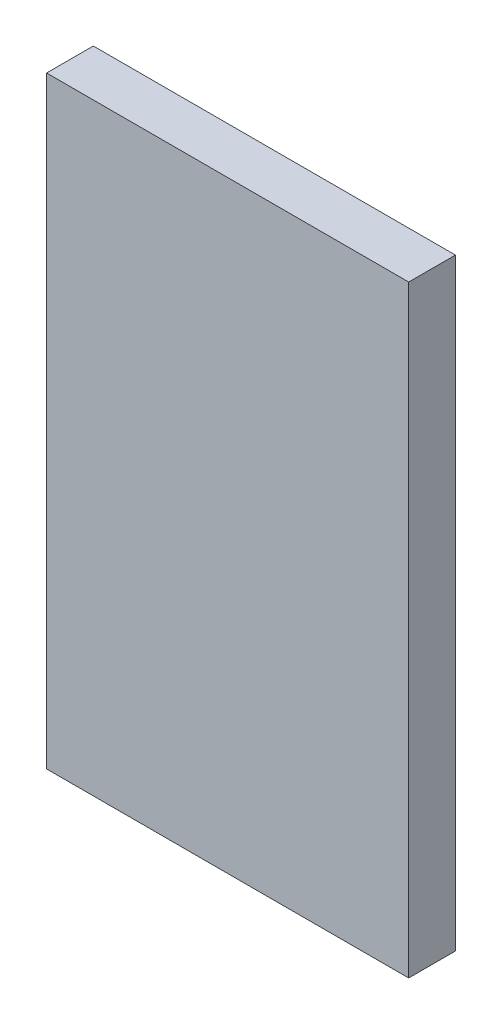
ISO-10303-21;
HEADER;
FILE_DESCRIPTION(('STEP AP214'),'2;1');
FILE_NAME('part.step','',(''),(''),'','','');
FILE_SCHEMA(('AUTOMOTIVE_DESIGN { 1 0 10303 214 1 1 1 1 }'));
ENDSEC;
DATA;
#1=APPLICATION_CONTEXT('core data for automotive mechanical design processes');
#2=APPLICATION_PROTOCOL_DEFINITION('international standard','automotive_design',2000,#1);
#3=PRODUCT_CONTEXT('',#1,'mechanical');
#4=PRODUCT('Part','Part','',(#3));
#5=PRODUCT_RELATED_PRODUCT_CATEGORY('part','',(#4));
#6=PRODUCT_DEFINITION_FORMATION('','',#4);
#7=PRODUCT_DEFINITION_CONTEXT('part definition',#1,'design');
#8=PRODUCT_DEFINITION('design','',#6,#7);
#9=PRODUCT_DEFINITION_SHAPE('','',#8);
#10=(LENGTH_UNIT() NAMED_UNIT(*) SI_UNIT(.MILLI.,.METRE.));
#11=(NAMED_UNIT(*) PLANE_ANGLE_UNIT() SI_UNIT($,.RADIAN.));
#12=(NAMED_UNIT(*) SI_UNIT($,.STERADIAN.) SOLID_ANGLE_UNIT());
#13=UNCERTAINTY_MEASURE_WITH_UNIT(LENGTH_MEASURE(1.E-05),#10,'distance_accuracy_value','');
#14=(GEOMETRIC_REPRESENTATION_CONTEXT(3) GLOBAL_UNCERTAINTY_ASSIGNED_CONTEXT((#13)) GLOBAL_UNIT_ASSIGNED_CONTEXT((#10,
#11,#12)) REPRESENTATION_CONTEXT('',''));
#15=CARTESIAN_POINT('',(0.,0.,0.));
#16=DIRECTION('',(0.,0.,1.));
#17=DIRECTION('',(1.,0.,0.));
#18=AXIS2_PLACEMENT_3D('',#15,#16,#17);
#19=CARTESIAN_POINT('',(-7.75,-12.9,2.));
#20=DIRECTION('',(1.,0.,0.));
#21=DIRECTION('',(0.,0.,-1.));
#22=AXIS2_PLACEMENT_3D('',#19,#20,#21);
#23=PLANE('',#22);
#24=DIRECTION('',(0.,-1.,0.));
#25=VECTOR('',#24,1.);
#26=CARTESIAN_POINT('',(-7.75,-12.9,0.));
#27=LINE('',#26,#25);
#28=CARTESIAN_POINT('',(-7.75,12.9,0.));
#29=VERTEX_POINT('',#28);
#30=CARTESIAN_POINT('',(-7.75,-12.9,0.));
#31=VERTEX_POINT('',#30);
#32=EDGE_CURVE('E100',#29,#31,#27,.T.);
#33=ORIENTED_EDGE('',*,*,#32,.T.);
#34=DIRECTION('',(0.,0.,-1.));
#35=VECTOR('',#34,1.);
#36=CARTESIAN_POINT('',(-7.75,-12.9,2.));
#37=LINE('',#36,#35);
#38=CARTESIAN_POINT('',(-7.75,-12.9,2.));
#39=VERTEX_POINT('',#38);
#40=EDGE_CURVE('E11',#39,#31,#37,.T.);
#41=ORIENTED_EDGE('',*,*,#40,.F.);
#42=DIRECTION('',(0.,-1.,0.));
#43=VECTOR('',#42,1.);
#44=CARTESIAN_POINT('',(-7.75,-12.9,2.));
#45=LINE('',#44,#43);
#46=CARTESIAN_POINT('',(-7.75,12.9,2.));
#47=VERTEX_POINT('',#46);
#48=EDGE_CURVE('E88',#47,#39,#45,.T.);
#49=ORIENTED_EDGE('',*,*,#48,.F.);
#50=DIRECTION('',(0.,0.,-1.));
#51=VECTOR('',#50,1.);
#52=CARTESIAN_POINT('',(-7.75,12.9,2.));
#53=LINE('',#52,#51);
#54=EDGE_CURVE('E96',#47,#29,#53,.T.);
#55=ORIENTED_EDGE('',*,*,#54,.T.);
#56=EDGE_LOOP('',(#33,#41,#49,#55));
#57=FACE_BOUND('',#56,.T.);
#58=ADVANCED_FACE('F37',(#57),#23,.F.);
#59=CARTESIAN_POINT('',(7.75,-12.9,2.));
#60=DIRECTION('',(0.,1.,0.));
#61=DIRECTION('',(-1.,0.,0.));
#62=AXIS2_PLACEMENT_3D('',#59,#60,#61);
#63=PLANE('',#62);
#64=DIRECTION('',(1.,0.,0.));
#65=VECTOR('',#64,1.);
#66=CARTESIAN_POINT('',(7.75,-12.9,0.));
#67=LINE('',#66,#65);
#68=CARTESIAN_POINT('',(7.75,-12.9,0.));
#69=VERTEX_POINT('',#68);
#70=EDGE_CURVE('E92',#31,#69,#67,.T.);
#71=ORIENTED_EDGE('',*,*,#70,.T.);
#72=DIRECTION('',(0.,0.,-1.));
#73=VECTOR('',#72,1.);
#74=CARTESIAN_POINT('',(7.75,-12.9,2.));
#75=LINE('',#74,#73);
#76=CARTESIAN_POINT('',(7.75,-12.9,2.));
#77=VERTEX_POINT('',#76);
#78=EDGE_CURVE('E45',#77,#69,#75,.T.);
#79=ORIENTED_EDGE('',*,*,#78,.F.);
#80=DIRECTION('',(1.,0.,0.));
#81=VECTOR('',#80,1.);
#82=CARTESIAN_POINT('',(7.75,-12.9,2.));
#83=LINE('',#82,#81);
#84=EDGE_CURVE('E83',#39,#77,#83,.T.);
#85=ORIENTED_EDGE('',*,*,#84,.F.);
#86=ORIENTED_EDGE('',*,*,#40,.T.);
#87=EDGE_LOOP('',(#71,#79,#85,#86));
#88=FACE_BOUND('',#87,.T.);
#89=ADVANCED_FACE('F91',(#88),#63,.F.);
#90=CARTESIAN_POINT('',(7.75,-12.9,2.));
#91=DIRECTION('',(-1.,0.,0.));
#92=DIRECTION('',(0.,0.,1.));
#93=AXIS2_PLACEMENT_3D('',#90,#91,#92);
#94=PLANE('',#93);
#95=DIRECTION('',(0.,1.,0.));
#96=VECTOR('',#95,1.);
#97=CARTESIAN_POINT('',(7.75,-12.9,0.));
#98=LINE('',#97,#96);
#99=CARTESIAN_POINT('',(7.75,12.9,0.));
#100=VERTEX_POINT('',#99);
#101=EDGE_CURVE('E70',#69,#100,#98,.T.);
#102=ORIENTED_EDGE('',*,*,#101,.T.);
#103=DIRECTION('',(0.,0.,-1.));
#104=VECTOR('',#103,1.);
#105=CARTESIAN_POINT('',(7.75,12.9,2.));
#106=LINE('',#105,#104);
#107=CARTESIAN_POINT('',(7.75,12.9,2.));
#108=VERTEX_POINT('',#107);
#109=EDGE_CURVE('E93',#108,#100,#106,.T.);
#110=ORIENTED_EDGE('',*,*,#109,.F.);
#111=DIRECTION('',(0.,1.,0.));
#112=VECTOR('',#111,1.);
#113=CARTESIAN_POINT('',(7.75,-12.9,2.));
#114=LINE('',#113,#112);
#115=EDGE_CURVE('E86',#77,#108,#114,.T.);
#116=ORIENTED_EDGE('',*,*,#115,.F.);
#117=ORIENTED_EDGE('',*,*,#78,.T.);
#118=EDGE_LOOP('',(#102,#110,#116,#117));
#119=FACE_BOUND('',#118,.T.);
#120=ADVANCED_FACE('F94',(#119),#94,.F.);
#121=CARTESIAN_POINT('',(7.75,12.9,2.));
#122=DIRECTION('',(0.,-1.,0.));
#123=DIRECTION('',(1.,0.,0.));
#124=AXIS2_PLACEMENT_3D('',#121,#122,#123);
#125=PLANE('',#124);
#126=DIRECTION('',(-1.,0.,0.));
#127=VECTOR('',#126,1.);
#128=CARTESIAN_POINT('',(7.75,12.9,0.));
#129=LINE('',#128,#127);
#130=EDGE_CURVE('E76',#100,#29,#129,.T.);
#131=ORIENTED_EDGE('',*,*,#130,.T.);
#132=ORIENTED_EDGE('',*,*,#54,.F.);
#133=DIRECTION('',(-1.,0.,0.));
#134=VECTOR('',#133,1.);
#135=CARTESIAN_POINT('',(7.75,12.9,2.));
#136=LINE('',#135,#134);
#137=EDGE_CURVE('E53',#108,#47,#136,.T.);
#138=ORIENTED_EDGE('',*,*,#137,.F.);
#139=ORIENTED_EDGE('',*,*,#109,.T.);
#140=EDGE_LOOP('',(#131,#132,#138,#139));
#141=FACE_BOUND('',#140,.T.);
#142=ADVANCED_FACE('F107',(#141),#125,.F.);
#143=CARTESIAN_POINT('',(0.,0.,2.));
#144=DIRECTION('',(0.,0.,1.));
#145=DIRECTION('',(1.,0.,0.));
#146=AXIS2_PLACEMENT_3D('',#143,#144,#145);
#147=PLANE('',#146);
#148=ORIENTED_EDGE('',*,*,#48,.T.);
#149=ORIENTED_EDGE('',*,*,#84,.T.);
#150=ORIENTED_EDGE('',*,*,#115,.T.);
#151=ORIENTED_EDGE('',*,*,#137,.T.);
#152=EDGE_LOOP('',(#148,#149,#150,#151));
#153=FACE_BOUND('',#152,.T.);
#154=ADVANCED_FACE('F84',(#153),#147,.T.);
#155=CARTESIAN_POINT('',(0.,0.,0.));
#156=DIRECTION('',(0.,0.,1.));
#157=DIRECTION('',(1.,0.,0.));
#158=AXIS2_PLACEMENT_3D('',#155,#156,#157);
#159=PLANE('',#158);
#160=ORIENTED_EDGE('',*,*,#32,.F.);
#161=ORIENTED_EDGE('',*,*,#130,.F.);
#162=ORIENTED_EDGE('',*,*,#101,.F.);
#163=ORIENTED_EDGE('',*,*,#70,.F.);
#164=EDGE_LOOP('',(#160,#161,#162,#163));
#165=FACE_BOUND('',#164,.T.);
#166=ADVANCED_FACE('F110',(#165),#159,.F.);
#167=CLOSED_SHELL('',(#58,#89,#120,#142,#154,#166));
#168=MANIFOLD_SOLID_BREP('B2',#167);
#169=ADVANCED_BREP_SHAPE_REPRESENTATION('',(#18,#168),#14);
#170=SHAPE_DEFINITION_REPRESENTATION(#9,#169);
ENDSEC;
END-ISO-10303-21;
